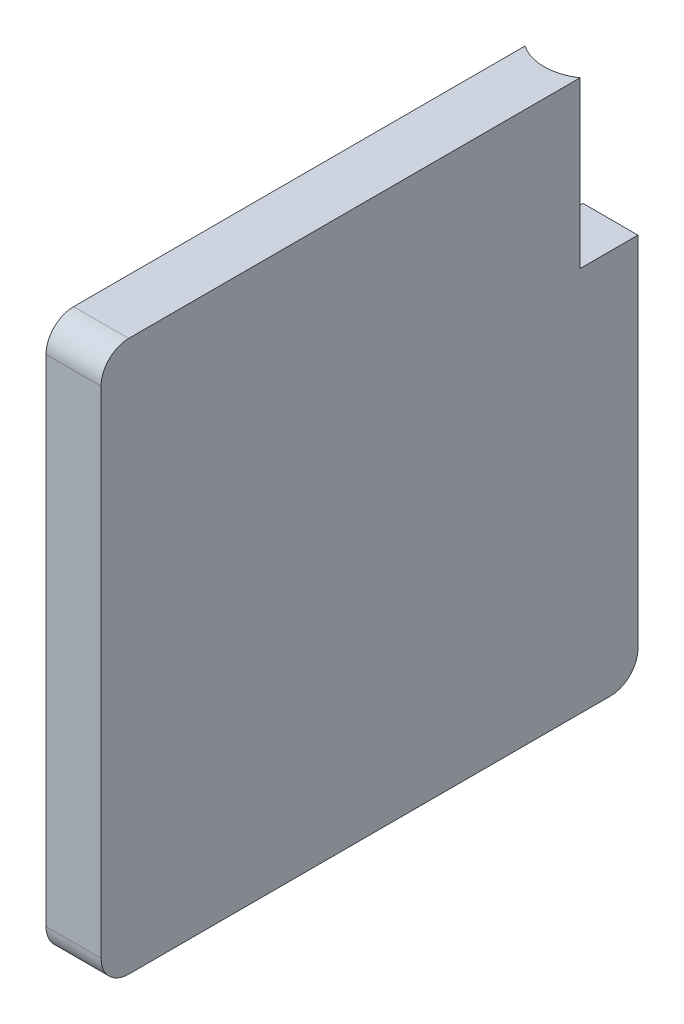
ISO-10303-21;
HEADER;
FILE_DESCRIPTION(('STEP AP214'),'2;1');
FILE_NAME('part.step','',(''),(''),'','','');
FILE_SCHEMA(('AUTOMOTIVE_DESIGN { 1 0 10303 214 1 1 1 1 }'));
ENDSEC;
DATA;
#1=APPLICATION_CONTEXT('core data for automotive mechanical design processes');
#2=APPLICATION_PROTOCOL_DEFINITION('international standard','automotive_design',2000,#1);
#3=PRODUCT_CONTEXT('',#1,'mechanical');
#4=PRODUCT('Part','Part','',(#3));
#5=PRODUCT_RELATED_PRODUCT_CATEGORY('part','',(#4));
#6=PRODUCT_DEFINITION_FORMATION('','',#4);
#7=PRODUCT_DEFINITION_CONTEXT('part definition',#1,'design');
#8=PRODUCT_DEFINITION('design','',#6,#7);
#9=PRODUCT_DEFINITION_SHAPE('','',#8);
#10=(LENGTH_UNIT() NAMED_UNIT(*) SI_UNIT(.MILLI.,.METRE.));
#11=(NAMED_UNIT(*) PLANE_ANGLE_UNIT() SI_UNIT($,.RADIAN.));
#12=(NAMED_UNIT(*) SI_UNIT($,.STERADIAN.) SOLID_ANGLE_UNIT());
#13=UNCERTAINTY_MEASURE_WITH_UNIT(LENGTH_MEASURE(1.E-05),#10,'distance_accuracy_value','');
#14=(GEOMETRIC_REPRESENTATION_CONTEXT(3) GLOBAL_UNCERTAINTY_ASSIGNED_CONTEXT((#13)) GLOBAL_UNIT_ASSIGNED_CONTEXT((#10,
#11,#12)) REPRESENTATION_CONTEXT('',''));
#15=CARTESIAN_POINT('',(0.,0.,0.));
#16=DIRECTION('',(0.,0.,1.));
#17=DIRECTION('',(1.,0.,0.));
#18=AXIS2_PLACEMENT_3D('',#15,#16,#17);
#19=CARTESIAN_POINT('',(-4.00000000000001,25.490763705489,39.));
#20=DIRECTION('',(1.,0.,0.));
#21=DIRECTION('',(0.,1.,0.));
#22=AXIS2_PLACEMENT_3D('',#19,#20,#21);
#23=PLANE('',#22);
#24=DIRECTION('',(0.,-1.,0.));
#25=VECTOR('',#24,1.);
#26=CARTESIAN_POINT('',(-4.00000000000001,25.490763705489,0.));
#27=LINE('',#26,#25);
#28=CARTESIAN_POINT('',(-4.,13.490763705489,0.));
#29=VERTEX_POINT('',#28);
#30=CARTESIAN_POINT('',(-4.,-12.509236294511,0.));
#31=VERTEX_POINT('',#30);
#32=EDGE_CURVE('E149',#29,#31,#27,.T.);
#33=ORIENTED_EDGE('',*,*,#32,.T.);
#34=CARTESIAN_POINT('',(-4.,-12.509236294511,2.));
#35=DIRECTION('',(1.,0.,0.));
#36=DIRECTION('',(0.,1.,0.));
#37=AXIS2_PLACEMENT_3D('',#34,#35,#36);
#38=CIRCLE('',#37,2.);
#39=CARTESIAN_POINT('',(-4.,-14.509236294511,2.));
#40=VERTEX_POINT('',#39);
#41=EDGE_CURVE('E45',#31,#40,#38,.F.);
#42=ORIENTED_EDGE('',*,*,#41,.T.);
#43=DIRECTION('',(0.,0.,-1.));
#44=VECTOR('',#43,1.);
#45=CARTESIAN_POINT('',(-4.,-14.509236294511,39.));
#46=LINE('',#45,#44);
#47=CARTESIAN_POINT('',(-4.,-14.509236294511,37.));
#48=VERTEX_POINT('',#47);
#49=EDGE_CURVE('E159',#48,#40,#46,.T.);
#50=ORIENTED_EDGE('',*,*,#49,.F.);
#51=CARTESIAN_POINT('',(-4.,-12.509236294511,37.));
#52=DIRECTION('',(1.,0.,0.));
#53=DIRECTION('',(0.,1.,0.));
#54=AXIS2_PLACEMENT_3D('',#51,#52,#53);
#55=CIRCLE('',#54,2.);
#56=CARTESIAN_POINT('',(-4.,-12.509236294511,39.));
#57=VERTEX_POINT('',#56);
#58=EDGE_CURVE('E52',#48,#57,#55,.F.);
#59=ORIENTED_EDGE('',*,*,#58,.T.);
#60=DIRECTION('',(0.,-1.,0.));
#61=VECTOR('',#60,1.);
#62=CARTESIAN_POINT('',(-4.00000000000001,25.490763705489,39.));
#63=LINE('',#62,#61);
#64=CARTESIAN_POINT('',(-4.00000000000001,23.490763705489,39.));
#65=VERTEX_POINT('',#64);
#66=EDGE_CURVE('E150',#65,#57,#63,.T.);
#67=ORIENTED_EDGE('',*,*,#66,.F.);
#68=CARTESIAN_POINT('',(-4.00000000000001,23.490763705489,37.));
#69=DIRECTION('',(1.,0.,0.));
#70=DIRECTION('',(0.,1.,0.));
#71=AXIS2_PLACEMENT_3D('',#68,#69,#70);
#72=CIRCLE('',#71,2.);
#73=CARTESIAN_POINT('',(-4.00000000000001,25.490763705489,37.));
#74=VERTEX_POINT('',#73);
#75=EDGE_CURVE('E168',#65,#74,#72,.F.);
#76=ORIENTED_EDGE('',*,*,#75,.T.);
#77=DIRECTION('',(0.,0.,-1.));
#78=VECTOR('',#77,1.);
#79=CARTESIAN_POINT('',(-4.00000000000001,25.490763705489,39.));
#80=LINE('',#79,#78);
#81=CARTESIAN_POINT('',(-4.00000000000001,25.490763705489,4.20458939115696));
#82=VERTEX_POINT('',#81);
#83=EDGE_CURVE('E124',#74,#82,#80,.T.);
#84=ORIENTED_EDGE('',*,*,#83,.T.);
#85=DIRECTION('',(0.,1.,0.));
#86=VECTOR('',#85,1.);
#87=CARTESIAN_POINT('',(-4.,13.490763705489,4.20458939115696));
#88=LINE('',#87,#86);
#89=CARTESIAN_POINT('',(-4.,13.490763705489,4.20458939115696));
#90=VERTEX_POINT('',#89);
#91=EDGE_CURVE('E134',#82,#90,#88,.F.);
#92=ORIENTED_EDGE('',*,*,#91,.T.);
#93=DIRECTION('',(0.,0.,-1.));
#94=VECTOR('',#93,1.);
#95=CARTESIAN_POINT('',(-4.,13.490763705489,39.));
#96=LINE('',#95,#94);
#97=EDGE_CURVE('E146',#90,#29,#96,.T.);
#98=ORIENTED_EDGE('',*,*,#97,.T.);
#99=EDGE_LOOP('',(#33,#42,#50,#59,#67,#76,#84,#92,#98));
#100=FACE_BOUND('',#99,.T.);
#101=ADVANCED_FACE('F37',(#100),#23,.F.);
#102=CARTESIAN_POINT('',(-4.,-14.509236294511,39.));
#103=DIRECTION('',(0.,1.,0.));
#104=DIRECTION('',(0.,0.,1.));
#105=AXIS2_PLACEMENT_3D('',#102,#103,#104);
#106=PLANE('',#105);
#107=ORIENTED_EDGE('',*,*,#49,.T.);
#108=DIRECTION('',(1.,0.,0.));
#109=VECTOR('',#108,1.);
#110=CARTESIAN_POINT('',(-4.,-14.509236294511,2.));
#111=LINE('',#110,#109);
#112=CARTESIAN_POINT('',(0.,-14.509236294511,2.));
#113=VERTEX_POINT('',#112);
#114=EDGE_CURVE('E175',#40,#113,#111,.T.);
#115=ORIENTED_EDGE('',*,*,#114,.T.);
#116=DIRECTION('',(0.,0.,-1.));
#117=VECTOR('',#116,1.);
#118=CARTESIAN_POINT('',(0.,-14.509236294511,39.));
#119=LINE('',#118,#117);
#120=CARTESIAN_POINT('',(0.,-14.509236294511,37.));
#121=VERTEX_POINT('',#120);
#122=EDGE_CURVE('E123',#121,#113,#119,.T.);
#123=ORIENTED_EDGE('',*,*,#122,.F.);
#124=DIRECTION('',(1.,0.,0.));
#125=VECTOR('',#124,1.);
#126=CARTESIAN_POINT('',(-4.,-14.509236294511,37.));
#127=LINE('',#126,#125);
#128=EDGE_CURVE('E173',#121,#48,#127,.F.);
#129=ORIENTED_EDGE('',*,*,#128,.T.);
#130=EDGE_LOOP('',(#107,#115,#123,#129));
#131=FACE_BOUND('',#130,.T.);
#132=ADVANCED_FACE('F187',(#131),#106,.F.);
#133=CARTESIAN_POINT('',(0.,25.490763705489,39.));
#134=DIRECTION('',(-1.,0.,0.));
#135=DIRECTION('',(0.,-1.,0.));
#136=AXIS2_PLACEMENT_3D('',#133,#134,#135);
#137=PLANE('',#136);
#138=ORIENTED_EDGE('',*,*,#122,.T.);
#139=CARTESIAN_POINT('',(0.,-12.509236294511,2.));
#140=DIRECTION('',(-1.,0.,0.));
#141=DIRECTION('',(0.,-1.,0.));
#142=AXIS2_PLACEMENT_3D('',#139,#140,#141);
#143=CIRCLE('',#142,2.);
#144=CARTESIAN_POINT('',(0.,-12.509236294511,0.));
#145=VERTEX_POINT('',#144);
#146=EDGE_CURVE('E180',#113,#145,#143,.F.);
#147=ORIENTED_EDGE('',*,*,#146,.T.);
#148=DIRECTION('',(0.,1.,0.));
#149=VECTOR('',#148,1.);
#150=CARTESIAN_POINT('',(0.,25.490763705489,0.));
#151=LINE('',#150,#149);
#152=CARTESIAN_POINT('',(0.,13.490763705489,0.));
#153=VERTEX_POINT('',#152);
#154=EDGE_CURVE('E153',#145,#153,#151,.T.);
#155=ORIENTED_EDGE('',*,*,#154,.T.);
#156=DIRECTION('',(0.,0.,-1.));
#157=VECTOR('',#156,1.);
#158=CARTESIAN_POINT('',(0.,13.490763705489,0.));
#159=LINE('',#158,#157);
#160=CARTESIAN_POINT('',(0.,13.490763705489,4.20458939115696));
#161=VERTEX_POINT('',#160);
#162=EDGE_CURVE('E140',#161,#153,#159,.T.);
#163=ORIENTED_EDGE('',*,*,#162,.F.);
#164=DIRECTION('',(0.,1.,0.));
#165=VECTOR('',#164,1.);
#166=CARTESIAN_POINT('',(0.,13.490763705489,4.20458939115696));
#167=LINE('',#166,#165);
#168=CARTESIAN_POINT('',(0.,25.490763705489,4.20458939115696));
#169=VERTEX_POINT('',#168);
#170=EDGE_CURVE('E131',#161,#169,#167,.T.);
#171=ORIENTED_EDGE('',*,*,#170,.T.);
#172=DIRECTION('',(0.,0.,-1.));
#173=VECTOR('',#172,1.);
#174=CARTESIAN_POINT('',(0.,25.490763705489,39.));
#175=LINE('',#174,#173);
#176=CARTESIAN_POINT('',(0.,25.490763705489,37.));
#177=VERTEX_POINT('',#176);
#178=EDGE_CURVE('E112',#177,#169,#175,.T.);
#179=ORIENTED_EDGE('',*,*,#178,.F.);
#180=CARTESIAN_POINT('',(0.,23.490763705489,37.));
#181=DIRECTION('',(-1.,0.,0.));
#182=DIRECTION('',(0.,-1.,0.));
#183=AXIS2_PLACEMENT_3D('',#180,#181,#182);
#184=CIRCLE('',#183,2.);
#185=CARTESIAN_POINT('',(0.,23.490763705489,39.));
#186=VERTEX_POINT('',#185);
#187=EDGE_CURVE('E171',#177,#186,#184,.F.);
#188=ORIENTED_EDGE('',*,*,#187,.T.);
#189=DIRECTION('',(0.,1.,0.));
#190=VECTOR('',#189,1.);
#191=CARTESIAN_POINT('',(0.,25.490763705489,39.));
#192=LINE('',#191,#190);
#193=CARTESIAN_POINT('',(0.,-12.509236294511,39.));
#194=VERTEX_POINT('',#193);
#195=EDGE_CURVE('E152',#194,#186,#192,.T.);
#196=ORIENTED_EDGE('',*,*,#195,.F.);
#197=CARTESIAN_POINT('',(0.,-12.509236294511,37.));
#198=DIRECTION('',(-1.,0.,0.));
#199=DIRECTION('',(0.,-1.,0.));
#200=AXIS2_PLACEMENT_3D('',#197,#198,#199);
#201=CIRCLE('',#200,2.);
#202=EDGE_CURVE('E178',#194,#121,#201,.F.);
#203=ORIENTED_EDGE('',*,*,#202,.T.);
#204=EDGE_LOOP('',(#138,#147,#155,#163,#171,#179,#188,#196,#203));
#205=FACE_BOUND('',#204,.T.);
#206=ADVANCED_FACE('F138',(#205),#137,.F.);
#207=CARTESIAN_POINT('',(-4.00000000000001,25.490763705489,39.));
#208=DIRECTION('',(0.,-1.,0.));
#209=DIRECTION('',(0.,0.,-1.));
#210=AXIS2_PLACEMENT_3D('',#207,#208,#209);
#211=PLANE('',#210);
#212=ORIENTED_EDGE('',*,*,#83,.F.);
#213=DIRECTION('',(-1.,0.,0.));
#214=VECTOR('',#213,1.);
#215=CARTESIAN_POINT('',(0.,25.490763705489,37.));
#216=LINE('',#215,#214);
#217=EDGE_CURVE('E118',#74,#177,#216,.F.);
#218=ORIENTED_EDGE('',*,*,#217,.T.);
#219=ORIENTED_EDGE('',*,*,#178,.T.);
#220=CARTESIAN_POINT('',(-2.,25.490763705489,1.24994833381894));
#221=DIRECTION('',(0.,1.,0.));
#222=DIRECTION('',(0.,0.,1.));
#223=AXIS2_PLACEMENT_3D('',#220,#221,#222);
#224=CIRCLE('',#223,3.56789907056065);
#225=EDGE_CURVE('E116',#82,#169,#224,.T.);
#226=ORIENTED_EDGE('',*,*,#225,.F.);
#227=EDGE_LOOP('',(#212,#218,#219,#226));
#228=FACE_BOUND('',#227,.T.);
#229=ADVANCED_FACE('F115',(#228),#211,.F.);
#230=CARTESIAN_POINT('',(0.,0.,39.));
#231=DIRECTION('',(0.,0.,1.));
#232=DIRECTION('',(1.,0.,0.));
#233=AXIS2_PLACEMENT_3D('',#230,#231,#232);
#234=PLANE('',#233);
#235=ORIENTED_EDGE('',*,*,#66,.T.);
#236=DIRECTION('',(1.,0.,0.));
#237=VECTOR('',#236,1.);
#238=CARTESIAN_POINT('',(0.,-12.509236294511,39.));
#239=LINE('',#238,#237);
#240=EDGE_CURVE('E11',#57,#194,#239,.T.);
#241=ORIENTED_EDGE('',*,*,#240,.T.);
#242=ORIENTED_EDGE('',*,*,#195,.T.);
#243=DIRECTION('',(-1.,0.,0.));
#244=VECTOR('',#243,1.);
#245=CARTESIAN_POINT('',(-4.00000000000001,23.490763705489,39.));
#246=LINE('',#245,#244);
#247=EDGE_CURVE('E165',#186,#65,#246,.T.);
#248=ORIENTED_EDGE('',*,*,#247,.T.);
#249=EDGE_LOOP('',(#235,#241,#242,#248));
#250=FACE_BOUND('',#249,.T.);
#251=ADVANCED_FACE('F199',(#250),#234,.T.);
#252=CARTESIAN_POINT('',(0.,0.,0.));
#253=DIRECTION('',(0.,0.,1.));
#254=DIRECTION('',(1.,0.,0.));
#255=AXIS2_PLACEMENT_3D('',#252,#253,#254);
#256=PLANE('',#255);
#257=ORIENTED_EDGE('',*,*,#154,.F.);
#258=DIRECTION('',(1.,0.,0.));
#259=VECTOR('',#258,1.);
#260=CARTESIAN_POINT('',(0.,-12.509236294511,0.));
#261=LINE('',#260,#259);
#262=EDGE_CURVE('E60',#145,#31,#261,.F.);
#263=ORIENTED_EDGE('',*,*,#262,.T.);
#264=ORIENTED_EDGE('',*,*,#32,.F.);
#265=DIRECTION('',(1.,0.,0.));
#266=VECTOR('',#265,1.);
#267=CARTESIAN_POINT('',(0.,13.490763705489,0.));
#268=LINE('',#267,#266);
#269=EDGE_CURVE('E162',#29,#153,#268,.T.);
#270=ORIENTED_EDGE('',*,*,#269,.T.);
#271=EDGE_LOOP('',(#257,#263,#264,#270));
#272=FACE_BOUND('',#271,.T.);
#273=ADVANCED_FACE('F191',(#272),#256,.F.);
#274=CARTESIAN_POINT('',(-39.,13.490763705489,0.));
#275=DIRECTION('',(0.,-1.,0.));
#276=DIRECTION('',(0.,0.,-1.));
#277=AXIS2_PLACEMENT_3D('',#274,#275,#276);
#278=PLANE('',#277);
#279=ORIENTED_EDGE('',*,*,#97,.F.);
#280=CARTESIAN_POINT('',(-2.,13.490763705489,1.24994833381894));
#281=DIRECTION('',(0.,1.,0.));
#282=DIRECTION('',(0.,0.,1.));
#283=AXIS2_PLACEMENT_3D('',#280,#281,#282);
#284=CIRCLE('',#283,3.56789907056065);
#285=EDGE_CURVE('E135',#90,#161,#284,.T.);
#286=ORIENTED_EDGE('',*,*,#285,.T.);
#287=ORIENTED_EDGE('',*,*,#162,.T.);
#288=ORIENTED_EDGE('',*,*,#269,.F.);
#289=EDGE_LOOP('',(#279,#286,#287,#288));
#290=FACE_BOUND('',#289,.T.);
#291=ADVANCED_FACE('F193',(#290),#278,.F.);
#292=CARTESIAN_POINT('',(-2.,13.490763705489,1.24994833381894));
#293=DIRECTION('',(0.,1.,0.));
#294=DIRECTION('',(0.,0.,1.));
#295=AXIS2_PLACEMENT_3D('',#292,#293,#294);
#296=CYLINDRICAL_SURFACE('',#295,3.56789907056065);
#297=ORIENTED_EDGE('',*,*,#225,.T.);
#298=ORIENTED_EDGE('',*,*,#170,.F.);
#299=ORIENTED_EDGE('',*,*,#285,.F.);
#300=ORIENTED_EDGE('',*,*,#91,.F.);
#301=EDGE_LOOP('',(#297,#298,#299,#300));
#302=FACE_BOUND('',#301,.T.);
#303=ADVANCED_FACE('F129',(#302),#296,.F.);
#304=CARTESIAN_POINT('',(0.,23.490763705489,37.));
#305=DIRECTION('',(1.,0.,0.));
#306=DIRECTION('',(0.,0.,-1.));
#307=AXIS2_PLACEMENT_3D('',#304,#305,#306);
#308=CYLINDRICAL_SURFACE('',#307,2.);
#309=ORIENTED_EDGE('',*,*,#187,.F.);
#310=ORIENTED_EDGE('',*,*,#217,.F.);
#311=ORIENTED_EDGE('',*,*,#75,.F.);
#312=ORIENTED_EDGE('',*,*,#247,.F.);
#313=EDGE_LOOP('',(#309,#310,#311,#312));
#314=FACE_BOUND('',#313,.T.);
#315=ADVANCED_FACE('F195',(#314),#308,.T.);
#316=CARTESIAN_POINT('',(-4.,-12.509236294511,2.));
#317=DIRECTION('',(1.,0.,0.));
#318=DIRECTION('',(0.,0.,-1.));
#319=AXIS2_PLACEMENT_3D('',#316,#317,#318);
#320=CYLINDRICAL_SURFACE('',#319,2.);
#321=ORIENTED_EDGE('',*,*,#41,.F.);
#322=ORIENTED_EDGE('',*,*,#262,.F.);
#323=ORIENTED_EDGE('',*,*,#146,.F.);
#324=ORIENTED_EDGE('',*,*,#114,.F.);
#325=EDGE_LOOP('',(#321,#322,#323,#324));
#326=FACE_BOUND('',#325,.T.);
#327=ADVANCED_FACE('F190',(#326),#320,.T.);
#328=CARTESIAN_POINT('',(0.,-12.509236294511,37.));
#329=DIRECTION('',(-1.,0.,0.));
#330=DIRECTION('',(0.,0.,1.));
#331=AXIS2_PLACEMENT_3D('',#328,#329,#330);
#332=CYLINDRICAL_SURFACE('',#331,2.);
#333=ORIENTED_EDGE('',*,*,#58,.F.);
#334=ORIENTED_EDGE('',*,*,#128,.F.);
#335=ORIENTED_EDGE('',*,*,#202,.F.);
#336=ORIENTED_EDGE('',*,*,#240,.F.);
#337=EDGE_LOOP('',(#333,#334,#335,#336));
#338=FACE_BOUND('',#337,.T.);
#339=ADVANCED_FACE('F39',(#338),#332,.T.);
#340=CLOSED_SHELL('',(#101,#132,#206,#229,#251,#273,#291,#303,#315,#327,#339));
#341=MANIFOLD_SOLID_BREP('B2',#340);
#342=ADVANCED_BREP_SHAPE_REPRESENTATION('',(#18,#341),#14);
#343=SHAPE_DEFINITION_REPRESENTATION(#9,#342);
ENDSEC;
END-ISO-10303-21;
